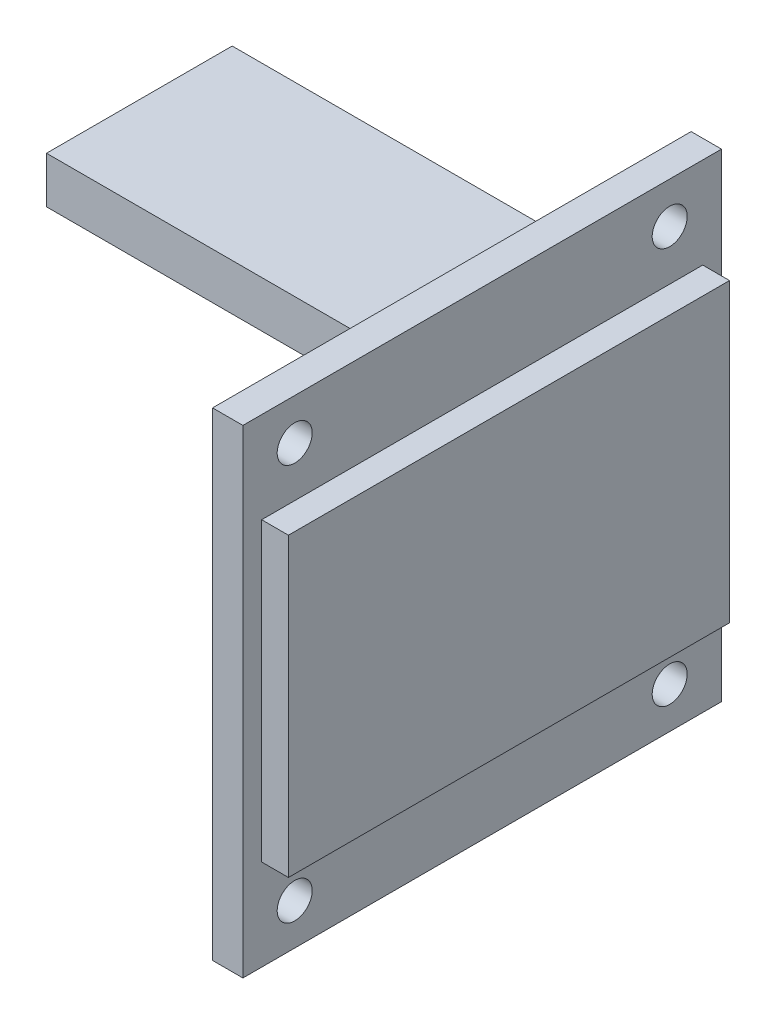
ISO-10303-21;
HEADER;
FILE_DESCRIPTION(('STEP AP214'),'2;1');
FILE_NAME('part.step','',(''),(''),'','','');
FILE_SCHEMA(('AUTOMOTIVE_DESIGN { 1 0 10303 214 1 1 1 1 }'));
ENDSEC;
DATA;
#1=APPLICATION_CONTEXT('core data for automotive mechanical design processes');
#2=APPLICATION_PROTOCOL_DEFINITION('international standard','automotive_design',2000,#1);
#3=PRODUCT_CONTEXT('',#1,'mechanical');
#4=PRODUCT('Part','Part','',(#3));
#5=PRODUCT_RELATED_PRODUCT_CATEGORY('part','',(#4));
#6=PRODUCT_DEFINITION_FORMATION('','',#4);
#7=PRODUCT_DEFINITION_CONTEXT('part definition',#1,'design');
#8=PRODUCT_DEFINITION('design','',#6,#7);
#9=PRODUCT_DEFINITION_SHAPE('','',#8);
#10=(LENGTH_UNIT() NAMED_UNIT(*) SI_UNIT(.MILLI.,.METRE.));
#11=(NAMED_UNIT(*) PLANE_ANGLE_UNIT() SI_UNIT($,.RADIAN.));
#12=(NAMED_UNIT(*) SI_UNIT($,.STERADIAN.) SOLID_ANGLE_UNIT());
#13=UNCERTAINTY_MEASURE_WITH_UNIT(LENGTH_MEASURE(1.E-05),#10,'distance_accuracy_value','');
#14=(GEOMETRIC_REPRESENTATION_CONTEXT(3) GLOBAL_UNCERTAINTY_ASSIGNED_CONTEXT((#13)) GLOBAL_UNIT_ASSIGNED_CONTEXT((#10,
#11,#12)) REPRESENTATION_CONTEXT('',''));
#15=CARTESIAN_POINT('',(0.,0.,0.));
#16=DIRECTION('',(0.,0.,1.));
#17=DIRECTION('',(1.,0.,0.));
#18=AXIS2_PLACEMENT_3D('',#15,#16,#17);
#19=CARTESIAN_POINT('',(0.,0.,0.));
#20=DIRECTION('',(1.,0.,0.));
#21=DIRECTION('',(0.,0.,-1.));
#22=AXIS2_PLACEMENT_3D('',#19,#20,#21);
#23=PLANE('',#22);
#24=CARTESIAN_POINT('',(0.,-11.1,10.5));
#25=DIRECTION('',(1.,0.,0.));
#26=DIRECTION('',(0.,0.,-1.));
#27=AXIS2_PLACEMENT_3D('',#24,#25,#26);
#28=CIRCLE('',#27,0.979999999999999);
#29=CARTESIAN_POINT('',(0.,-11.1,9.52));
#30=VERTEX_POINT('',#29);
#31=EDGE_CURVE('E627',#30,#30,#28,.T.);
#32=ORIENTED_EDGE('',*,*,#31,.T.);
#33=EDGE_LOOP('',(#32));
#34=FACE_BOUND('',#33,.T.);
#35=CARTESIAN_POINT('',(0.,-11.1,-10.5));
#36=DIRECTION('',(1.,0.,0.));
#37=DIRECTION('',(0.,0.,-1.));
#38=AXIS2_PLACEMENT_3D('',#35,#36,#37);
#39=CIRCLE('',#38,0.979999999999999);
#40=CARTESIAN_POINT('',(0.,-11.1,-11.48));
#41=VERTEX_POINT('',#40);
#42=EDGE_CURVE('E628',#41,#41,#39,.T.);
#43=ORIENTED_EDGE('',*,*,#42,.T.);
#44=EDGE_LOOP('',(#43));
#45=FACE_BOUND('',#44,.T.);
#46=CARTESIAN_POINT('',(0.,11.1,-10.5));
#47=DIRECTION('',(1.,0.,0.));
#48=DIRECTION('',(0.,0.,-1.));
#49=AXIS2_PLACEMENT_3D('',#46,#47,#48);
#50=CIRCLE('',#49,0.979999999999999);
#51=CARTESIAN_POINT('',(0.,11.1,-11.48));
#52=VERTEX_POINT('',#51);
#53=EDGE_CURVE('E632',#52,#52,#50,.T.);
#54=ORIENTED_EDGE('',*,*,#53,.T.);
#55=EDGE_LOOP('',(#54));
#56=FACE_BOUND('',#55,.T.);
#57=CARTESIAN_POINT('',(0.,11.1,10.5));
#58=DIRECTION('',(1.,0.,0.));
#59=DIRECTION('',(0.,0.,-1.));
#60=AXIS2_PLACEMENT_3D('',#57,#58,#59);
#61=CIRCLE('',#60,0.979999999999999);
#62=CARTESIAN_POINT('',(0.,11.1,9.52000000000001));
#63=VERTEX_POINT('',#62);
#64=EDGE_CURVE('E647',#63,#63,#61,.T.);
#65=ORIENTED_EDGE('',*,*,#64,.T.);
#66=EDGE_LOOP('',(#65));
#67=FACE_BOUND('',#66,.T.);
#68=DIRECTION('',(0.,1.,0.));
#69=VECTOR('',#68,1.);
#70=CARTESIAN_POINT('',(0.,12.9,5.19999999999999));
#71=LINE('',#70,#69);
#72=CARTESIAN_POINT('',(0.,10.3,5.19999999999999));
#73=VERTEX_POINT('',#72);
#74=CARTESIAN_POINT('',(0.,12.9,5.19999999999999));
#75=VERTEX_POINT('',#74);
#76=EDGE_CURVE('E202',#73,#75,#71,.T.);
#77=ORIENTED_EDGE('',*,*,#76,.F.);
#78=DIRECTION('',(0.,0.,1.));
#79=VECTOR('',#78,1.);
#80=CARTESIAN_POINT('',(0.,10.3,-5.20000000000001));
#81=LINE('',#80,#79);
#82=CARTESIAN_POINT('',(0.,10.3,-5.20000000000001));
#83=VERTEX_POINT('',#82);
#84=EDGE_CURVE('E215',#83,#73,#81,.T.);
#85=ORIENTED_EDGE('',*,*,#84,.F.);
#86=DIRECTION('',(0.,-1.,0.));
#87=VECTOR('',#86,1.);
#88=CARTESIAN_POINT('',(0.,12.9,-5.20000000000001));
#89=LINE('',#88,#87);
#90=CARTESIAN_POINT('',(0.,12.9,-5.20000000000001));
#91=VERTEX_POINT('',#90);
#92=EDGE_CURVE('E224',#91,#83,#89,.T.);
#93=ORIENTED_EDGE('',*,*,#92,.F.);
#94=DIRECTION('',(0.,0.,-1.));
#95=VECTOR('',#94,1.);
#96=CARTESIAN_POINT('',(0.,12.9,-5.20000000000001));
#97=LINE('',#96,#95);
#98=EDGE_CURVE('E205',#75,#91,#97,.T.);
#99=ORIENTED_EDGE('',*,*,#98,.F.);
#100=EDGE_LOOP('',(#77,#85,#93,#99));
#101=FACE_BOUND('',#100,.T.);
#102=DIRECTION('',(0.,1.,0.));
#103=VECTOR('',#102,1.);
#104=CARTESIAN_POINT('',(0.,13.4,-13.4));
#105=LINE('',#104,#103);
#106=CARTESIAN_POINT('',(0.,-13.4,-13.4));
#107=VERTEX_POINT('',#106);
#108=CARTESIAN_POINT('',(0.,13.4,-13.4));
#109=VERTEX_POINT('',#108);
#110=EDGE_CURVE('E279',#107,#109,#105,.T.);
#111=ORIENTED_EDGE('',*,*,#110,.F.);
#112=DIRECTION('',(0.,0.,-1.));
#113=VECTOR('',#112,1.);
#114=CARTESIAN_POINT('',(0.,-13.4,13.4));
#115=LINE('',#114,#113);
#116=CARTESIAN_POINT('',(0.,-13.4,13.4));
#117=VERTEX_POINT('',#116);
#118=EDGE_CURVE('E288',#117,#107,#115,.T.);
#119=ORIENTED_EDGE('',*,*,#118,.F.);
#120=DIRECTION('',(0.,-1.,0.));
#121=VECTOR('',#120,1.);
#122=CARTESIAN_POINT('',(0.,13.4,13.4));
#123=LINE('',#122,#121);
#124=CARTESIAN_POINT('',(0.,13.4,13.4));
#125=VERTEX_POINT('',#124);
#126=EDGE_CURVE('E285',#125,#117,#123,.T.);
#127=ORIENTED_EDGE('',*,*,#126,.F.);
#128=DIRECTION('',(0.,0.,1.));
#129=VECTOR('',#128,1.);
#130=CARTESIAN_POINT('',(0.,13.4,13.4));
#131=LINE('',#130,#129);
#132=EDGE_CURVE('E282',#109,#125,#131,.T.);
#133=ORIENTED_EDGE('',*,*,#132,.F.);
#134=EDGE_LOOP('',(#111,#119,#127,#133));
#135=FACE_BOUND('',#134,.T.);
#136=DIRECTION('',(0.,1.,0.));
#137=VECTOR('',#136,1.);
#138=CARTESIAN_POINT('',(0.,3.6,11.5));
#139=LINE('',#138,#137);
#140=CARTESIAN_POINT('',(0.,-2.4,11.5));
#141=VERTEX_POINT('',#140);
#142=CARTESIAN_POINT('',(0.,3.6,11.5));
#143=VERTEX_POINT('',#142);
#144=EDGE_CURVE('E201',#141,#143,#139,.T.);
#145=ORIENTED_EDGE('',*,*,#144,.F.);
#146=DIRECTION('',(0.,0.,1.));
#147=VECTOR('',#146,1.);
#148=CARTESIAN_POINT('',(0.,-2.4,-11.5));
#149=LINE('',#148,#147);
#150=CARTESIAN_POINT('',(0.,-2.4,-11.5));
#151=VERTEX_POINT('',#150);
#152=EDGE_CURVE('E198',#151,#141,#149,.T.);
#153=ORIENTED_EDGE('',*,*,#152,.F.);
#154=DIRECTION('',(0.,-1.,0.));
#155=VECTOR('',#154,1.);
#156=CARTESIAN_POINT('',(0.,3.6,-11.5));
#157=LINE('',#156,#155);
#158=CARTESIAN_POINT('',(0.,3.6,-11.5));
#159=VERTEX_POINT('',#158);
#160=EDGE_CURVE('E89',#159,#151,#157,.T.);
#161=ORIENTED_EDGE('',*,*,#160,.F.);
#162=DIRECTION('',(0.,0.,-1.));
#163=VECTOR('',#162,1.);
#164=CARTESIAN_POINT('',(0.,3.6,-11.5));
#165=LINE('',#164,#163);
#166=EDGE_CURVE('E84',#143,#159,#165,.T.);
#167=ORIENTED_EDGE('',*,*,#166,.F.);
#168=EDGE_LOOP('',(#145,#153,#161,#167));
#169=FACE_BOUND('',#168,.T.);
#170=ADVANCED_FACE('F69',(#34,#45,#56,#67,#101,#135,#169),#23,.F.);
#171=CARTESIAN_POINT('',(3.2,13.4,-13.4));
#172=DIRECTION('',(0.,0.,1.));
#173=DIRECTION('',(0.,-1.,0.));
#174=AXIS2_PLACEMENT_3D('',#171,#172,#173);
#175=PLANE('',#174);
#176=DIRECTION('',(0.,1.,0.));
#177=VECTOR('',#176,1.);
#178=CARTESIAN_POINT('',(1.7,-13.4,-13.4));
#179=LINE('',#178,#177);
#180=CARTESIAN_POINT('',(1.7,-13.4,-13.4));
#181=VERTEX_POINT('',#180);
#182=CARTESIAN_POINT('',(1.7,13.4,-13.4));
#183=VERTEX_POINT('',#182);
#184=EDGE_CURVE('E273',#181,#183,#179,.T.);
#185=ORIENTED_EDGE('',*,*,#184,.F.);
#186=DIRECTION('',(-1.,0.,0.));
#187=VECTOR('',#186,1.);
#188=CARTESIAN_POINT('',(3.2,-13.4,-13.4));
#189=LINE('',#188,#187);
#190=EDGE_CURVE('E291',#181,#107,#189,.T.);
#191=ORIENTED_EDGE('',*,*,#190,.T.);
#192=ORIENTED_EDGE('',*,*,#110,.T.);
#193=DIRECTION('',(-1.,0.,0.));
#194=VECTOR('',#193,1.);
#195=CARTESIAN_POINT('',(3.2,13.4,-13.4));
#196=LINE('',#195,#194);
#197=EDGE_CURVE('E12',#183,#109,#196,.T.);
#198=ORIENTED_EDGE('',*,*,#197,.F.);
#199=EDGE_LOOP('',(#185,#191,#192,#198));
#200=FACE_BOUND('',#199,.T.);
#201=ADVANCED_FACE('F71',(#200),#175,.F.);
#202=CARTESIAN_POINT('',(3.2,13.4,13.4));
#203=DIRECTION('',(0.,-1.,0.));
#204=DIRECTION('',(0.,0.,-1.));
#205=AXIS2_PLACEMENT_3D('',#202,#203,#204);
#206=PLANE('',#205);
#207=DIRECTION('',(0.,0.,1.));
#208=VECTOR('',#207,1.);
#209=CARTESIAN_POINT('',(1.7,13.4,-13.4));
#210=LINE('',#209,#208);
#211=CARTESIAN_POINT('',(1.7,13.4,13.4));
#212=VERTEX_POINT('',#211);
#213=EDGE_CURVE('E275',#183,#212,#210,.T.);
#214=ORIENTED_EDGE('',*,*,#213,.F.);
#215=ORIENTED_EDGE('',*,*,#197,.T.);
#216=ORIENTED_EDGE('',*,*,#132,.T.);
#217=DIRECTION('',(-1.,0.,0.));
#218=VECTOR('',#217,1.);
#219=CARTESIAN_POINT('',(3.2,13.4,13.4));
#220=LINE('',#219,#218);
#221=EDGE_CURVE('E77',#212,#125,#220,.T.);
#222=ORIENTED_EDGE('',*,*,#221,.F.);
#223=EDGE_LOOP('',(#214,#215,#216,#222));
#224=FACE_BOUND('',#223,.T.);
#225=ADVANCED_FACE('F304',(#224),#206,.F.);
#226=CARTESIAN_POINT('',(3.2,13.4,13.4));
#227=DIRECTION('',(0.,0.,-1.));
#228=DIRECTION('',(0.,1.,0.));
#229=AXIS2_PLACEMENT_3D('',#226,#227,#228);
#230=PLANE('',#229);
#231=DIRECTION('',(0.,-1.,0.));
#232=VECTOR('',#231,1.);
#233=CARTESIAN_POINT('',(1.7,13.4,13.4));
#234=LINE('',#233,#232);
#235=CARTESIAN_POINT('',(1.7,-13.4,13.4));
#236=VERTEX_POINT('',#235);
#237=EDGE_CURVE('E277',#212,#236,#234,.T.);
#238=ORIENTED_EDGE('',*,*,#237,.F.);
#239=ORIENTED_EDGE('',*,*,#221,.T.);
#240=ORIENTED_EDGE('',*,*,#126,.T.);
#241=DIRECTION('',(-1.,0.,0.));
#242=VECTOR('',#241,1.);
#243=CARTESIAN_POINT('',(3.2,-13.4,13.4));
#244=LINE('',#243,#242);
#245=EDGE_CURVE('E293',#236,#117,#244,.T.);
#246=ORIENTED_EDGE('',*,*,#245,.F.);
#247=EDGE_LOOP('',(#238,#239,#240,#246));
#248=FACE_BOUND('',#247,.T.);
#249=ADVANCED_FACE('F297',(#248),#230,.F.);
#250=CARTESIAN_POINT('',(3.2,-13.4,13.4));
#251=DIRECTION('',(0.,1.,0.));
#252=DIRECTION('',(0.,0.,1.));
#253=AXIS2_PLACEMENT_3D('',#250,#251,#252);
#254=PLANE('',#253);
#255=DIRECTION('',(0.,0.,-1.));
#256=VECTOR('',#255,1.);
#257=CARTESIAN_POINT('',(1.7,-13.4,13.4));
#258=LINE('',#257,#256);
#259=EDGE_CURVE('E265',#236,#181,#258,.T.);
#260=ORIENTED_EDGE('',*,*,#259,.F.);
#261=ORIENTED_EDGE('',*,*,#245,.T.);
#262=ORIENTED_EDGE('',*,*,#118,.T.);
#263=ORIENTED_EDGE('',*,*,#190,.F.);
#264=EDGE_LOOP('',(#260,#261,#262,#263));
#265=FACE_BOUND('',#264,.T.);
#266=ADVANCED_FACE('F311',(#265),#254,.F.);
#267=CARTESIAN_POINT('',(1.7,0.,0.));
#268=DIRECTION('',(1.,0.,0.));
#269=DIRECTION('',(0.,0.,-1.));
#270=AXIS2_PLACEMENT_3D('',#267,#268,#269);
#271=PLANE('',#270);
#272=CARTESIAN_POINT('',(1.7,-11.1,10.5));
#273=DIRECTION('',(1.,0.,0.));
#274=DIRECTION('',(0.,0.,-1.));
#275=AXIS2_PLACEMENT_3D('',#272,#273,#274);
#276=CIRCLE('',#275,0.979999999999999);
#277=CARTESIAN_POINT('',(1.7,-11.1,9.52));
#278=VERTEX_POINT('',#277);
#279=EDGE_CURVE('E625',#278,#278,#276,.T.);
#280=ORIENTED_EDGE('',*,*,#279,.F.);
#281=EDGE_LOOP('',(#280));
#282=FACE_BOUND('',#281,.T.);
#283=CARTESIAN_POINT('',(1.7,-11.1,-10.5));
#284=DIRECTION('',(1.,0.,0.));
#285=DIRECTION('',(0.,0.,-1.));
#286=AXIS2_PLACEMENT_3D('',#283,#284,#285);
#287=CIRCLE('',#286,0.979999999999999);
#288=CARTESIAN_POINT('',(1.7,-11.1,-11.48));
#289=VERTEX_POINT('',#288);
#290=EDGE_CURVE('E655',#289,#289,#287,.T.);
#291=ORIENTED_EDGE('',*,*,#290,.F.);
#292=EDGE_LOOP('',(#291));
#293=FACE_BOUND('',#292,.T.);
#294=CARTESIAN_POINT('',(1.7,11.1,-10.5));
#295=DIRECTION('',(1.,0.,0.));
#296=DIRECTION('',(0.,0.,-1.));
#297=AXIS2_PLACEMENT_3D('',#294,#295,#296);
#298=CIRCLE('',#297,0.979999999999999);
#299=CARTESIAN_POINT('',(1.7,11.1,-11.48));
#300=VERTEX_POINT('',#299);
#301=EDGE_CURVE('E653',#300,#300,#298,.T.);
#302=ORIENTED_EDGE('',*,*,#301,.F.);
#303=EDGE_LOOP('',(#302));
#304=FACE_BOUND('',#303,.T.);
#305=CARTESIAN_POINT('',(1.7,11.1,10.5));
#306=DIRECTION('',(1.,0.,0.));
#307=DIRECTION('',(0.,0.,-1.));
#308=AXIS2_PLACEMENT_3D('',#305,#306,#307);
#309=CIRCLE('',#308,0.979999999999999);
#310=CARTESIAN_POINT('',(1.7,11.1,9.52000000000001));
#311=VERTEX_POINT('',#310);
#312=EDGE_CURVE('E650',#311,#311,#309,.T.);
#313=ORIENTED_EDGE('',*,*,#312,.F.);
#314=EDGE_LOOP('',(#313));
#315=FACE_BOUND('',#314,.T.);
#316=DIRECTION('',(0.,-1.,0.));
#317=VECTOR('',#316,1.);
#318=CARTESIAN_POINT('',(1.7,8.3,12.35));
#319=LINE('',#318,#317);
#320=CARTESIAN_POINT('',(1.7,8.3,12.35));
#321=VERTEX_POINT('',#320);
#322=CARTESIAN_POINT('',(1.7,-8.3,12.35));
#323=VERTEX_POINT('',#322);
#324=EDGE_CURVE('E250',#321,#323,#319,.T.);
#325=ORIENTED_EDGE('',*,*,#324,.F.);
#326=DIRECTION('',(0.,0.,-1.));
#327=VECTOR('',#326,1.);
#328=CARTESIAN_POINT('',(1.7,8.3,12.35));
#329=LINE('',#328,#327);
#330=CARTESIAN_POINT('',(1.7,8.3,-12.35));
#331=VERTEX_POINT('',#330);
#332=EDGE_CURVE('E247',#321,#331,#329,.T.);
#333=ORIENTED_EDGE('',*,*,#332,.T.);
#334=DIRECTION('',(0.,-1.,0.));
#335=VECTOR('',#334,1.);
#336=CARTESIAN_POINT('',(1.7,8.3,-12.35));
#337=LINE('',#336,#335);
#338=CARTESIAN_POINT('',(1.7,-8.3,-12.35));
#339=VERTEX_POINT('',#338);
#340=EDGE_CURVE('E244',#331,#339,#337,.T.);
#341=ORIENTED_EDGE('',*,*,#340,.T.);
#342=DIRECTION('',(0.,0.,-1.));
#343=VECTOR('',#342,1.);
#344=CARTESIAN_POINT('',(1.7,-8.3,12.35));
#345=LINE('',#344,#343);
#346=EDGE_CURVE('E241',#323,#339,#345,.T.);
#347=ORIENTED_EDGE('',*,*,#346,.F.);
#348=EDGE_LOOP('',(#325,#333,#341,#347));
#349=FACE_BOUND('',#348,.T.);
#350=ORIENTED_EDGE('',*,*,#259,.T.);
#351=ORIENTED_EDGE('',*,*,#184,.T.);
#352=ORIENTED_EDGE('',*,*,#213,.T.);
#353=ORIENTED_EDGE('',*,*,#237,.T.);
#354=EDGE_LOOP('',(#350,#351,#352,#353));
#355=FACE_BOUND('',#354,.T.);
#356=ADVANCED_FACE('F314',(#282,#293,#304,#315,#349,#355),#271,.T.);
#357=CARTESIAN_POINT('',(1.7,-8.3,12.35));
#358=DIRECTION('',(0.,-1.,0.));
#359=DIRECTION('',(0.,0.,-1.));
#360=AXIS2_PLACEMENT_3D('',#357,#358,#359);
#361=PLANE('',#360);
#362=DIRECTION('',(0.,0.,-1.));
#363=VECTOR('',#362,1.);
#364=CARTESIAN_POINT('',(3.2,-8.3,12.35));
#365=LINE('',#364,#363);
#366=CARTESIAN_POINT('',(3.2,-8.3,12.35));
#367=VERTEX_POINT('',#366);
#368=CARTESIAN_POINT('',(3.2,-8.3,-12.35));
#369=VERTEX_POINT('',#368);
#370=EDGE_CURVE('E240',#367,#369,#365,.T.);
#371=ORIENTED_EDGE('',*,*,#370,.F.);
#372=DIRECTION('',(1.,0.,0.));
#373=VECTOR('',#372,1.);
#374=CARTESIAN_POINT('',(1.7,-8.3,12.35));
#375=LINE('',#374,#373);
#376=EDGE_CURVE('E263',#323,#367,#375,.T.);
#377=ORIENTED_EDGE('',*,*,#376,.F.);
#378=ORIENTED_EDGE('',*,*,#346,.T.);
#379=DIRECTION('',(1.,0.,0.));
#380=VECTOR('',#379,1.);
#381=CARTESIAN_POINT('',(1.7,-8.3,-12.35));
#382=LINE('',#381,#380);
#383=EDGE_CURVE('E253',#339,#369,#382,.T.);
#384=ORIENTED_EDGE('',*,*,#383,.T.);
#385=EDGE_LOOP('',(#371,#377,#378,#384));
#386=FACE_BOUND('',#385,.T.);
#387=ADVANCED_FACE('F347',(#386),#361,.T.);
#388=CARTESIAN_POINT('',(1.7,8.3,12.35));
#389=DIRECTION('',(0.,0.,1.));
#390=DIRECTION('',(1.,0.,0.));
#391=AXIS2_PLACEMENT_3D('',#388,#389,#390);
#392=PLANE('',#391);
#393=DIRECTION('',(0.,-1.,0.));
#394=VECTOR('',#393,1.);
#395=CARTESIAN_POINT('',(3.2,8.3,12.35));
#396=LINE('',#395,#394);
#397=CARTESIAN_POINT('',(3.2,8.3,12.35));
#398=VERTEX_POINT('',#397);
#399=EDGE_CURVE('E245',#398,#367,#396,.T.);
#400=ORIENTED_EDGE('',*,*,#399,.F.);
#401=DIRECTION('',(1.,0.,0.));
#402=VECTOR('',#401,1.);
#403=CARTESIAN_POINT('',(1.7,8.3,12.35));
#404=LINE('',#403,#402);
#405=EDGE_CURVE('E266',#321,#398,#404,.T.);
#406=ORIENTED_EDGE('',*,*,#405,.F.);
#407=ORIENTED_EDGE('',*,*,#324,.T.);
#408=ORIENTED_EDGE('',*,*,#376,.T.);
#409=EDGE_LOOP('',(#400,#406,#407,#408));
#410=FACE_BOUND('',#409,.T.);
#411=ADVANCED_FACE('F353',(#410),#392,.T.);
#412=CARTESIAN_POINT('',(1.7,8.3,12.35));
#413=DIRECTION('',(0.,-1.,0.));
#414=DIRECTION('',(0.,0.,-1.));
#415=AXIS2_PLACEMENT_3D('',#412,#413,#414);
#416=PLANE('',#415);
#417=DIRECTION('',(0.,0.,-1.));
#418=VECTOR('',#417,1.);
#419=CARTESIAN_POINT('',(3.2,8.3,12.35));
#420=LINE('',#419,#418);
#421=CARTESIAN_POINT('',(3.2,8.3,-12.35));
#422=VERTEX_POINT('',#421);
#423=EDGE_CURVE('E259',#398,#422,#420,.T.);
#424=ORIENTED_EDGE('',*,*,#423,.T.);
#425=DIRECTION('',(1.,0.,0.));
#426=VECTOR('',#425,1.);
#427=CARTESIAN_POINT('',(1.7,8.3,-12.35));
#428=LINE('',#427,#426);
#429=EDGE_CURVE('E268',#331,#422,#428,.T.);
#430=ORIENTED_EDGE('',*,*,#429,.F.);
#431=ORIENTED_EDGE('',*,*,#332,.F.);
#432=ORIENTED_EDGE('',*,*,#405,.T.);
#433=EDGE_LOOP('',(#424,#430,#431,#432));
#434=FACE_BOUND('',#433,.T.);
#435=ADVANCED_FACE('F368',(#434),#416,.F.);
#436=CARTESIAN_POINT('',(1.7,8.3,-12.35));
#437=DIRECTION('',(0.,0.,1.));
#438=DIRECTION('',(0.,-1.,0.));
#439=AXIS2_PLACEMENT_3D('',#436,#437,#438);
#440=PLANE('',#439);
#441=DIRECTION('',(0.,-1.,0.));
#442=VECTOR('',#441,1.);
#443=CARTESIAN_POINT('',(3.2,8.3,-12.35));
#444=LINE('',#443,#442);
#445=EDGE_CURVE('E256',#422,#369,#444,.T.);
#446=ORIENTED_EDGE('',*,*,#445,.T.);
#447=ORIENTED_EDGE('',*,*,#383,.F.);
#448=ORIENTED_EDGE('',*,*,#340,.F.);
#449=ORIENTED_EDGE('',*,*,#429,.T.);
#450=EDGE_LOOP('',(#446,#447,#448,#449));
#451=FACE_BOUND('',#450,.T.);
#452=ADVANCED_FACE('F381',(#451),#440,.F.);
#453=CARTESIAN_POINT('',(3.2,0.,0.));
#454=DIRECTION('',(1.,0.,0.));
#455=DIRECTION('',(0.,0.,-1.));
#456=AXIS2_PLACEMENT_3D('',#453,#454,#455);
#457=PLANE('',#456);
#458=ORIENTED_EDGE('',*,*,#399,.T.);
#459=ORIENTED_EDGE('',*,*,#370,.T.);
#460=ORIENTED_EDGE('',*,*,#445,.F.);
#461=ORIENTED_EDGE('',*,*,#423,.F.);
#462=EDGE_LOOP('',(#458,#459,#460,#461));
#463=FACE_BOUND('',#462,.T.);
#464=ADVANCED_FACE('F330',(#463),#457,.T.);
#465=CARTESIAN_POINT('',(-17.5,12.9,5.19999999999999));
#466=DIRECTION('',(0.,0.,-1.));
#467=DIRECTION('',(0.,1.,0.));
#468=AXIS2_PLACEMENT_3D('',#465,#466,#467);
#469=PLANE('',#468);
#470=ORIENTED_EDGE('',*,*,#76,.T.);
#471=DIRECTION('',(1.,0.,0.));
#472=VECTOR('',#471,1.);
#473=CARTESIAN_POINT('',(-17.5,12.9,5.19999999999999));
#474=LINE('',#473,#472);
#475=CARTESIAN_POINT('',(-17.5,12.9,5.19999999999999));
#476=VERTEX_POINT('',#475);
#477=EDGE_CURVE('E237',#476,#75,#474,.T.);
#478=ORIENTED_EDGE('',*,*,#477,.F.);
#479=DIRECTION('',(0.,1.,0.));
#480=VECTOR('',#479,1.);
#481=CARTESIAN_POINT('',(-17.5,12.9,5.19999999999999));
#482=LINE('',#481,#480);
#483=CARTESIAN_POINT('',(-17.5,10.3,5.19999999999999));
#484=VERTEX_POINT('',#483);
#485=EDGE_CURVE('E211',#484,#476,#482,.T.);
#486=ORIENTED_EDGE('',*,*,#485,.F.);
#487=DIRECTION('',(1.,0.,0.));
#488=VECTOR('',#487,1.);
#489=CARTESIAN_POINT('',(-17.5,10.3,5.19999999999999));
#490=LINE('',#489,#488);
#491=EDGE_CURVE('E220',#484,#73,#490,.T.);
#492=ORIENTED_EDGE('',*,*,#491,.T.);
#493=EDGE_LOOP('',(#470,#478,#486,#492));
#494=FACE_BOUND('',#493,.T.);
#495=ADVANCED_FACE('F406',(#494),#469,.F.);
#496=CARTESIAN_POINT('',(-17.5,12.9,-5.20000000000001));
#497=DIRECTION('',(0.,-1.,0.));
#498=DIRECTION('',(0.,0.,-1.));
#499=AXIS2_PLACEMENT_3D('',#496,#497,#498);
#500=PLANE('',#499);
#501=ORIENTED_EDGE('',*,*,#98,.T.);
#502=DIRECTION('',(1.,0.,0.));
#503=VECTOR('',#502,1.);
#504=CARTESIAN_POINT('',(-17.5,12.9,-5.20000000000001));
#505=LINE('',#504,#503);
#506=CARTESIAN_POINT('',(-17.5,12.9,-5.20000000000001));
#507=VERTEX_POINT('',#506);
#508=EDGE_CURVE('E234',#507,#91,#505,.T.);
#509=ORIENTED_EDGE('',*,*,#508,.F.);
#510=DIRECTION('',(0.,0.,-1.));
#511=VECTOR('',#510,1.);
#512=CARTESIAN_POINT('',(-17.5,12.9,-5.20000000000001));
#513=LINE('',#512,#511);
#514=EDGE_CURVE('E214',#476,#507,#513,.T.);
#515=ORIENTED_EDGE('',*,*,#514,.F.);
#516=ORIENTED_EDGE('',*,*,#477,.T.);
#517=EDGE_LOOP('',(#501,#509,#515,#516));
#518=FACE_BOUND('',#517,.T.);
#519=ADVANCED_FACE('F415',(#518),#500,.F.);
#520=CARTESIAN_POINT('',(-17.5,12.9,-5.20000000000001));
#521=DIRECTION('',(0.,0.,1.));
#522=DIRECTION('',(1.,0.,0.));
#523=AXIS2_PLACEMENT_3D('',#520,#521,#522);
#524=PLANE('',#523);
#525=ORIENTED_EDGE('',*,*,#92,.T.);
#526=DIRECTION('',(1.,0.,0.));
#527=VECTOR('',#526,1.);
#528=CARTESIAN_POINT('',(-17.5,10.3,-5.20000000000001));
#529=LINE('',#528,#527);
#530=CARTESIAN_POINT('',(-17.5,10.3,-5.20000000000001));
#531=VERTEX_POINT('',#530);
#532=EDGE_CURVE('E231',#531,#83,#529,.T.);
#533=ORIENTED_EDGE('',*,*,#532,.F.);
#534=DIRECTION('',(0.,-1.,0.));
#535=VECTOR('',#534,1.);
#536=CARTESIAN_POINT('',(-17.5,12.9,-5.20000000000001));
#537=LINE('',#536,#535);
#538=EDGE_CURVE('E217',#507,#531,#537,.T.);
#539=ORIENTED_EDGE('',*,*,#538,.F.);
#540=ORIENTED_EDGE('',*,*,#508,.T.);
#541=EDGE_LOOP('',(#525,#533,#539,#540));
#542=FACE_BOUND('',#541,.T.);
#543=ADVANCED_FACE('F429',(#542),#524,.F.);
#544=CARTESIAN_POINT('',(-17.5,10.3,-5.20000000000001));
#545=DIRECTION('',(0.,1.,0.));
#546=DIRECTION('',(0.,0.,1.));
#547=AXIS2_PLACEMENT_3D('',#544,#545,#546);
#548=PLANE('',#547);
#549=ORIENTED_EDGE('',*,*,#84,.T.);
#550=ORIENTED_EDGE('',*,*,#491,.F.);
#551=DIRECTION('',(0.,0.,1.));
#552=VECTOR('',#551,1.);
#553=CARTESIAN_POINT('',(-17.5,10.3,-5.20000000000001));
#554=LINE('',#553,#552);
#555=EDGE_CURVE('E219',#531,#484,#554,.T.);
#556=ORIENTED_EDGE('',*,*,#555,.F.);
#557=ORIENTED_EDGE('',*,*,#532,.T.);
#558=EDGE_LOOP('',(#549,#550,#556,#557));
#559=FACE_BOUND('',#558,.T.);
#560=ADVANCED_FACE('F442',(#559),#548,.F.);
#561=CARTESIAN_POINT('',(-17.5,0.,0.));
#562=DIRECTION('',(-1.,0.,0.));
#563=DIRECTION('',(0.,0.,1.));
#564=AXIS2_PLACEMENT_3D('',#561,#562,#563);
#565=PLANE('',#564);
#566=ORIENTED_EDGE('',*,*,#485,.T.);
#567=ORIENTED_EDGE('',*,*,#514,.T.);
#568=ORIENTED_EDGE('',*,*,#538,.T.);
#569=ORIENTED_EDGE('',*,*,#555,.T.);
#570=EDGE_LOOP('',(#566,#567,#568,#569));
#571=FACE_BOUND('',#570,.T.);
#572=ADVANCED_FACE('F455',(#571),#565,.T.);
#573=CARTESIAN_POINT('',(-1.5,3.6,11.5));
#574=DIRECTION('',(0.,0.,-1.));
#575=DIRECTION('',(-1.,0.,0.));
#576=AXIS2_PLACEMENT_3D('',#573,#574,#575);
#577=PLANE('',#576);
#578=ORIENTED_EDGE('',*,*,#144,.T.);
#579=DIRECTION('',(1.,0.,0.));
#580=VECTOR('',#579,1.);
#581=CARTESIAN_POINT('',(-1.5,3.6,11.5));
#582=LINE('',#581,#580);
#583=CARTESIAN_POINT('',(-1.5,3.6,11.5));
#584=VERTEX_POINT('',#583);
#585=EDGE_CURVE('E182',#584,#143,#582,.T.);
#586=ORIENTED_EDGE('',*,*,#585,.F.);
#587=DIRECTION('',(0.,1.,0.));
#588=VECTOR('',#587,1.);
#589=CARTESIAN_POINT('',(-1.5,3.6,11.5));
#590=LINE('',#589,#588);
#591=CARTESIAN_POINT('',(-1.5,-2.4,11.5));
#592=VERTEX_POINT('',#591);
#593=EDGE_CURVE('E189',#592,#584,#590,.T.);
#594=ORIENTED_EDGE('',*,*,#593,.F.);
#595=DIRECTION('',(1.,0.,0.));
#596=VECTOR('',#595,1.);
#597=CARTESIAN_POINT('',(-1.5,-2.4,11.5));
#598=LINE('',#597,#596);
#599=EDGE_CURVE('E637',#592,#141,#598,.T.);
#600=ORIENTED_EDGE('',*,*,#599,.T.);
#601=EDGE_LOOP('',(#578,#586,#594,#600));
#602=FACE_BOUND('',#601,.T.);
#603=ADVANCED_FACE('F200',(#602),#577,.F.);
#604=CARTESIAN_POINT('',(-1.5,3.6,-11.5));
#605=DIRECTION('',(0.,-1.,0.));
#606=DIRECTION('',(0.,0.,-1.));
#607=AXIS2_PLACEMENT_3D('',#604,#605,#606);
#608=PLANE('',#607);
#609=ORIENTED_EDGE('',*,*,#166,.T.);
#610=DIRECTION('',(1.,0.,0.));
#611=VECTOR('',#610,1.);
#612=CARTESIAN_POINT('',(-1.5,3.6,-11.5));
#613=LINE('',#612,#611);
#614=CARTESIAN_POINT('',(-1.5,3.6,-11.5));
#615=VERTEX_POINT('',#614);
#616=EDGE_CURVE('E185',#615,#159,#613,.T.);
#617=ORIENTED_EDGE('',*,*,#616,.F.);
#618=DIRECTION('',(0.,0.,-1.));
#619=VECTOR('',#618,1.);
#620=CARTESIAN_POINT('',(-1.5,3.6,-11.5));
#621=LINE('',#620,#619);
#622=EDGE_CURVE('E178',#584,#615,#621,.T.);
#623=ORIENTED_EDGE('',*,*,#622,.F.);
#624=ORIENTED_EDGE('',*,*,#585,.T.);
#625=EDGE_LOOP('',(#609,#617,#623,#624));
#626=FACE_BOUND('',#625,.T.);
#627=ADVANCED_FACE('F180',(#626),#608,.F.);
#628=CARTESIAN_POINT('',(-1.5,3.6,-11.5));
#629=DIRECTION('',(0.,0.,1.));
#630=DIRECTION('',(1.,0.,0.));
#631=AXIS2_PLACEMENT_3D('',#628,#629,#630);
#632=PLANE('',#631);
#633=ORIENTED_EDGE('',*,*,#160,.T.);
#634=DIRECTION('',(1.,0.,0.));
#635=VECTOR('',#634,1.);
#636=CARTESIAN_POINT('',(-1.5,-2.4,-11.5));
#637=LINE('',#636,#635);
#638=CARTESIAN_POINT('',(-1.5,-2.4,-11.5));
#639=VERTEX_POINT('',#638);
#640=EDGE_CURVE('E207',#639,#151,#637,.T.);
#641=ORIENTED_EDGE('',*,*,#640,.F.);
#642=DIRECTION('',(0.,-1.,0.));
#643=VECTOR('',#642,1.);
#644=CARTESIAN_POINT('',(-1.5,3.6,-11.5));
#645=LINE('',#644,#643);
#646=EDGE_CURVE('E188',#615,#639,#645,.T.);
#647=ORIENTED_EDGE('',*,*,#646,.F.);
#648=ORIENTED_EDGE('',*,*,#616,.T.);
#649=EDGE_LOOP('',(#633,#641,#647,#648));
#650=FACE_BOUND('',#649,.T.);
#651=ADVANCED_FACE('F485',(#650),#632,.F.);
#652=CARTESIAN_POINT('',(-1.5,-2.4,-11.5));
#653=DIRECTION('',(0.,1.,0.));
#654=DIRECTION('',(0.,0.,1.));
#655=AXIS2_PLACEMENT_3D('',#652,#653,#654);
#656=PLANE('',#655);
#657=ORIENTED_EDGE('',*,*,#152,.T.);
#658=ORIENTED_EDGE('',*,*,#599,.F.);
#659=DIRECTION('',(0.,0.,1.));
#660=VECTOR('',#659,1.);
#661=CARTESIAN_POINT('',(-1.5,-2.4,-11.5));
#662=LINE('',#661,#660);
#663=EDGE_CURVE('E194',#639,#592,#662,.T.);
#664=ORIENTED_EDGE('',*,*,#663,.F.);
#665=ORIENTED_EDGE('',*,*,#640,.T.);
#666=EDGE_LOOP('',(#657,#658,#664,#665));
#667=FACE_BOUND('',#666,.T.);
#668=ADVANCED_FACE('F493',(#667),#656,.F.);
#669=CARTESIAN_POINT('',(-1.5,0.,0.));
#670=DIRECTION('',(-1.,0.,0.));
#671=DIRECTION('',(0.,0.,1.));
#672=AXIS2_PLACEMENT_3D('',#669,#670,#671);
#673=PLANE('',#672);
#674=ORIENTED_EDGE('',*,*,#593,.T.);
#675=ORIENTED_EDGE('',*,*,#622,.T.);
#676=ORIENTED_EDGE('',*,*,#646,.T.);
#677=ORIENTED_EDGE('',*,*,#663,.T.);
#678=EDGE_LOOP('',(#674,#675,#676,#677));
#679=FACE_BOUND('',#678,.T.);
#680=ADVANCED_FACE('F192',(#679),#673,.T.);
#681=CARTESIAN_POINT('',(-8.3,11.1,10.5));
#682=DIRECTION('',(1.,0.,0.));
#683=DIRECTION('',(0.,0.,-1.));
#684=AXIS2_PLACEMENT_3D('',#681,#682,#683);
#685=CYLINDRICAL_SURFACE('',#684,0.979999999999999);
#686=ORIENTED_EDGE('',*,*,#312,.T.);
#687=EDGE_LOOP('',(#686));
#688=FACE_BOUND('',#687,.T.);
#689=ORIENTED_EDGE('',*,*,#64,.F.);
#690=EDGE_LOOP('',(#689));
#691=FACE_BOUND('',#690,.T.);
#692=ADVANCED_FACE('F509',(#688,#691),#685,.F.);
#693=CARTESIAN_POINT('',(-8.3,11.1,-10.5));
#694=DIRECTION('',(1.,0.,0.));
#695=DIRECTION('',(0.,0.,-1.));
#696=AXIS2_PLACEMENT_3D('',#693,#694,#695);
#697=CYLINDRICAL_SURFACE('',#696,0.979999999999999);
#698=ORIENTED_EDGE('',*,*,#301,.T.);
#699=EDGE_LOOP('',(#698));
#700=FACE_BOUND('',#699,.T.);
#701=ORIENTED_EDGE('',*,*,#53,.F.);
#702=EDGE_LOOP('',(#701));
#703=FACE_BOUND('',#702,.T.);
#704=ADVANCED_FACE('F529',(#700,#703),#697,.F.);
#705=CARTESIAN_POINT('',(-8.3,-11.1,-10.5));
#706=DIRECTION('',(1.,0.,0.));
#707=DIRECTION('',(0.,0.,-1.));
#708=AXIS2_PLACEMENT_3D('',#705,#706,#707);
#709=CYLINDRICAL_SURFACE('',#708,0.979999999999999);
#710=ORIENTED_EDGE('',*,*,#290,.T.);
#711=EDGE_LOOP('',(#710));
#712=FACE_BOUND('',#711,.T.);
#713=ORIENTED_EDGE('',*,*,#42,.F.);
#714=EDGE_LOOP('',(#713));
#715=FACE_BOUND('',#714,.T.);
#716=ADVANCED_FACE('F538',(#712,#715),#709,.F.);
#717=CARTESIAN_POINT('',(-8.3,-11.1,10.5));
#718=DIRECTION('',(1.,0.,0.));
#719=DIRECTION('',(0.,0.,-1.));
#720=AXIS2_PLACEMENT_3D('',#717,#718,#719);
#721=CYLINDRICAL_SURFACE('',#720,0.979999999999999);
#722=ORIENTED_EDGE('',*,*,#279,.T.);
#723=EDGE_LOOP('',(#722));
#724=FACE_BOUND('',#723,.T.);
#725=ORIENTED_EDGE('',*,*,#31,.F.);
#726=EDGE_LOOP('',(#725));
#727=FACE_BOUND('',#726,.T.);
#728=ADVANCED_FACE('F547',(#724,#727),#721,.F.);
#729=CLOSED_SHELL('',(#170,#201,#225,#249,#266,#356,#387,#411,#435,#452,#464,#495,#519,#543,
#560,#572,#603,#627,#651,#668,#680,#692,#704,#716,#728));
#730=MANIFOLD_SOLID_BREP('B2',#729);
#731=ADVANCED_BREP_SHAPE_REPRESENTATION('',(#18,#730),#14);
#732=SHAPE_DEFINITION_REPRESENTATION(#9,#731);
ENDSEC;
END-ISO-10303-21;
